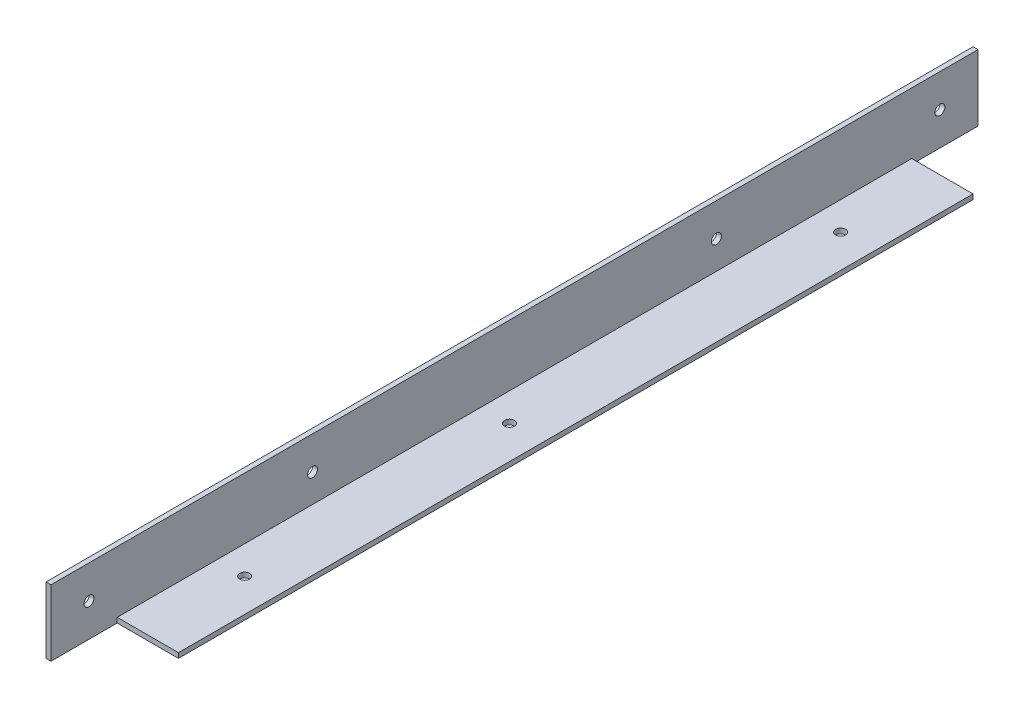
ISO-10303-21;
HEADER;
FILE_DESCRIPTION(('STEP AP214'),'2;1');
FILE_NAME('part.step','',(''),(''),'','','');
FILE_SCHEMA(('AUTOMOTIVE_DESIGN { 1 0 10303 214 1 1 1 1 }'));
ENDSEC;
DATA;
#1=APPLICATION_CONTEXT('core data for automotive mechanical design processes');
#2=APPLICATION_PROTOCOL_DEFINITION('international standard','automotive_design',2000,#1);
#3=PRODUCT_CONTEXT('',#1,'mechanical');
#4=PRODUCT('Part','Part','',(#3));
#5=PRODUCT_RELATED_PRODUCT_CATEGORY('part','',(#4));
#6=PRODUCT_DEFINITION_FORMATION('','',#4);
#7=PRODUCT_DEFINITION_CONTEXT('part definition',#1,'design');
#8=PRODUCT_DEFINITION('design','',#6,#7);
#9=PRODUCT_DEFINITION_SHAPE('','',#8);
#10=(LENGTH_UNIT() NAMED_UNIT(*) SI_UNIT(.MILLI.,.METRE.));
#11=(NAMED_UNIT(*) PLANE_ANGLE_UNIT() SI_UNIT($,.RADIAN.));
#12=(NAMED_UNIT(*) SI_UNIT($,.STERADIAN.) SOLID_ANGLE_UNIT());
#13=UNCERTAINTY_MEASURE_WITH_UNIT(LENGTH_MEASURE(1.E-05),#10,'distance_accuracy_value','');
#14=(GEOMETRIC_REPRESENTATION_CONTEXT(3) GLOBAL_UNCERTAINTY_ASSIGNED_CONTEXT((#13)) GLOBAL_UNIT_ASSIGNED_CONTEXT((#10,
#11,#12)) REPRESENTATION_CONTEXT('',''));
#15=CARTESIAN_POINT('',(0.,0.,0.));
#16=DIRECTION('',(0.,0.,1.));
#17=DIRECTION('',(1.,0.,0.));
#18=AXIS2_PLACEMENT_3D('',#15,#16,#17);
#19=CARTESIAN_POINT('',(0.,0.,0.));
#20=DIRECTION('',(0.,0.,1.));
#21=DIRECTION('',(1.,0.,0.));
#22=AXIS2_PLACEMENT_3D('',#19,#20,#21);
#23=PLANE('',#22);
#24=DIRECTION('',(0.,-1.,0.));
#25=VECTOR('',#24,1.);
#26=CARTESIAN_POINT('',(1.5,0.,0.));
#27=LINE('',#26,#25);
#28=CARTESIAN_POINT('',(1.5,1.5,0.));
#29=VERTEX_POINT('',#28);
#30=CARTESIAN_POINT('',(1.5,0.,0.));
#31=VERTEX_POINT('',#30);
#32=EDGE_CURVE('E11',#29,#31,#27,.T.);
#33=ORIENTED_EDGE('',*,*,#32,.F.);
#34=DIRECTION('',(-1.,0.,0.));
#35=VECTOR('',#34,1.);
#36=CARTESIAN_POINT('',(20.,1.5,0.));
#37=LINE('',#36,#35);
#38=CARTESIAN_POINT('',(20.,1.5,0.));
#39=VERTEX_POINT('',#38);
#40=EDGE_CURVE('E132',#39,#29,#37,.T.);
#41=ORIENTED_EDGE('',*,*,#40,.F.);
#42=DIRECTION('',(0.,1.,0.));
#43=VECTOR('',#42,1.);
#44=CARTESIAN_POINT('',(20.,0.,0.));
#45=LINE('',#44,#43);
#46=CARTESIAN_POINT('',(20.,0.,0.));
#47=VERTEX_POINT('',#46);
#48=EDGE_CURVE('E133',#47,#39,#45,.T.);
#49=ORIENTED_EDGE('',*,*,#48,.F.);
#50=DIRECTION('',(1.,0.,0.));
#51=VECTOR('',#50,1.);
#52=CARTESIAN_POINT('',(0.,0.,0.));
#53=LINE('',#52,#51);
#54=EDGE_CURVE('E138',#31,#47,#53,.T.);
#55=ORIENTED_EDGE('',*,*,#54,.F.);
#56=EDGE_LOOP('',(#33,#41,#49,#55));
#57=FACE_BOUND('',#56,.T.);
#58=ADVANCED_FACE('F31',(#57),#23,.F.);
#59=CARTESIAN_POINT('',(0.,20.,240.));
#60=DIRECTION('',(1.,0.,0.));
#61=DIRECTION('',(0.,1.,0.));
#62=AXIS2_PLACEMENT_3D('',#59,#60,#61);
#63=PLANE('',#62);
#64=CARTESIAN_POINT('',(0.,10.,59.));
#65=DIRECTION('',(1.,0.,0.));
#66=DIRECTION('',(0.,1.,0.));
#67=AXIS2_PLACEMENT_3D('',#64,#65,#66);
#68=CIRCLE('',#67,1.5);
#69=CARTESIAN_POINT('',(0.,11.5,59.));
#70=VERTEX_POINT('',#69);
#71=EDGE_CURVE('E261',#70,#70,#68,.T.);
#72=ORIENTED_EDGE('',*,*,#71,.T.);
#73=EDGE_LOOP('',(#72));
#74=FACE_BOUND('',#73,.T.);
#75=CARTESIAN_POINT('',(0.,10.,181.));
#76=DIRECTION('',(1.,0.,0.));
#77=DIRECTION('',(0.,1.,0.));
#78=AXIS2_PLACEMENT_3D('',#75,#76,#77);
#79=CIRCLE('',#78,1.5);
#80=CARTESIAN_POINT('',(0.,11.5,181.));
#81=VERTEX_POINT('',#80);
#82=EDGE_CURVE('E255',#81,#81,#79,.T.);
#83=ORIENTED_EDGE('',*,*,#82,.T.);
#84=EDGE_LOOP('',(#83));
#85=FACE_BOUND('',#84,.T.);
#86=CARTESIAN_POINT('',(0.,10.,-8.5));
#87=DIRECTION('',(1.,0.,0.));
#88=DIRECTION('',(0.,1.,0.));
#89=AXIS2_PLACEMENT_3D('',#86,#87,#88);
#90=CIRCLE('',#89,1.5);
#91=CARTESIAN_POINT('',(0.,11.5,-8.5));
#92=VERTEX_POINT('',#91);
#93=EDGE_CURVE('E249',#92,#92,#90,.T.);
#94=ORIENTED_EDGE('',*,*,#93,.T.);
#95=EDGE_LOOP('',(#94));
#96=FACE_BOUND('',#95,.T.);
#97=CARTESIAN_POINT('',(0.,10.,248.5));
#98=DIRECTION('',(1.,0.,0.));
#99=DIRECTION('',(0.,1.,0.));
#100=AXIS2_PLACEMENT_3D('',#97,#98,#99);
#101=CIRCLE('',#100,1.50000000000003);
#102=CARTESIAN_POINT('',(0.,11.5,248.5));
#103=VERTEX_POINT('',#102);
#104=EDGE_CURVE('E120',#103,#103,#101,.T.);
#105=ORIENTED_EDGE('',*,*,#104,.T.);
#106=EDGE_LOOP('',(#105));
#107=FACE_BOUND('',#106,.T.);
#108=DIRECTION('',(0.,0.,-1.));
#109=VECTOR('',#108,1.);
#110=CARTESIAN_POINT('',(0.,20.,240.));
#111=LINE('',#110,#109);
#112=CARTESIAN_POINT('',(0.,20.,260.));
#113=VERTEX_POINT('',#112);
#114=CARTESIAN_POINT('',(0.,20.,-20.));
#115=VERTEX_POINT('',#114);
#116=EDGE_CURVE('E149',#113,#115,#111,.T.);
#117=ORIENTED_EDGE('',*,*,#116,.T.);
#118=DIRECTION('',(0.,1.,0.));
#119=VECTOR('',#118,1.);
#120=CARTESIAN_POINT('',(0.,20.,-20.));
#121=LINE('',#120,#119);
#122=CARTESIAN_POINT('',(0.,0.,-20.));
#123=VERTEX_POINT('',#122);
#124=EDGE_CURVE('E111',#123,#115,#121,.T.);
#125=ORIENTED_EDGE('',*,*,#124,.F.);
#126=DIRECTION('',(0.,0.,-1.));
#127=VECTOR('',#126,1.);
#128=CARTESIAN_POINT('',(0.,0.,240.));
#129=LINE('',#128,#127);
#130=CARTESIAN_POINT('',(0.,0.,260.));
#131=VERTEX_POINT('',#130);
#132=EDGE_CURVE('E40',#131,#123,#129,.T.);
#133=ORIENTED_EDGE('',*,*,#132,.F.);
#134=DIRECTION('',(0.,-1.,0.));
#135=VECTOR('',#134,1.);
#136=CARTESIAN_POINT('',(0.,0.,260.));
#137=LINE('',#136,#135);
#138=EDGE_CURVE('E125',#113,#131,#137,.T.);
#139=ORIENTED_EDGE('',*,*,#138,.F.);
#140=EDGE_LOOP('',(#117,#125,#133,#139));
#141=FACE_BOUND('',#140,.T.);
#142=ADVANCED_FACE('F33',(#74,#85,#96,#107,#141),#63,.F.);
#143=CARTESIAN_POINT('',(0.,0.,240.));
#144=DIRECTION('',(0.,1.,0.));
#145=DIRECTION('',(0.,0.,1.));
#146=AXIS2_PLACEMENT_3D('',#143,#144,#145);
#147=PLANE('',#146);
#148=CARTESIAN_POINT('',(10.,0.,130.));
#149=DIRECTION('',(0.,1.,0.));
#150=DIRECTION('',(-1.,0.,0.));
#151=AXIS2_PLACEMENT_3D('',#148,#149,#150);
#152=CIRCLE('',#151,1.5);
#153=CARTESIAN_POINT('',(8.5,0.,130.));
#154=VERTEX_POINT('',#153);
#155=EDGE_CURVE('E180',#154,#154,#152,.T.);
#156=ORIENTED_EDGE('',*,*,#155,.T.);
#157=EDGE_LOOP('',(#156));
#158=FACE_BOUND('',#157,.T.);
#159=CARTESIAN_POINT('',(10.,0.,210.));
#160=DIRECTION('',(0.,1.,0.));
#161=DIRECTION('',(-1.,0.,0.));
#162=AXIS2_PLACEMENT_3D('',#159,#160,#161);
#163=CIRCLE('',#162,1.5);
#164=CARTESIAN_POINT('',(8.5,0.,210.));
#165=VERTEX_POINT('',#164);
#166=EDGE_CURVE('E202',#165,#165,#163,.T.);
#167=ORIENTED_EDGE('',*,*,#166,.T.);
#168=EDGE_LOOP('',(#167));
#169=FACE_BOUND('',#168,.T.);
#170=CARTESIAN_POINT('',(10.,0.,30.));
#171=DIRECTION('',(0.,1.,0.));
#172=DIRECTION('',(-1.,0.,0.));
#173=AXIS2_PLACEMENT_3D('',#170,#171,#172);
#174=CIRCLE('',#173,1.5);
#175=CARTESIAN_POINT('',(8.5,0.,30.));
#176=VERTEX_POINT('',#175);
#177=EDGE_CURVE('E144',#176,#176,#174,.T.);
#178=ORIENTED_EDGE('',*,*,#177,.T.);
#179=EDGE_LOOP('',(#178));
#180=FACE_BOUND('',#179,.T.);
#181=ORIENTED_EDGE('',*,*,#132,.T.);
#182=DIRECTION('',(-1.,0.,0.));
#183=VECTOR('',#182,1.);
#184=CARTESIAN_POINT('',(0.,0.,-20.));
#185=LINE('',#184,#183);
#186=CARTESIAN_POINT('',(1.5,0.,-20.));
#187=VERTEX_POINT('',#186);
#188=EDGE_CURVE('E102',#187,#123,#185,.T.);
#189=ORIENTED_EDGE('',*,*,#188,.F.);
#190=DIRECTION('',(0.,0.,1.));
#191=VECTOR('',#190,1.);
#192=CARTESIAN_POINT('',(1.5,0.,-20.));
#193=LINE('',#192,#191);
#194=EDGE_CURVE('E106',#187,#31,#193,.T.);
#195=ORIENTED_EDGE('',*,*,#194,.T.);
#196=ORIENTED_EDGE('',*,*,#54,.T.);
#197=DIRECTION('',(0.,0.,-1.));
#198=VECTOR('',#197,1.);
#199=CARTESIAN_POINT('',(20.,0.,240.));
#200=LINE('',#199,#198);
#201=CARTESIAN_POINT('',(20.,0.,240.));
#202=VERTEX_POINT('',#201);
#203=EDGE_CURVE('E156',#202,#47,#200,.T.);
#204=ORIENTED_EDGE('',*,*,#203,.F.);
#205=DIRECTION('',(1.,0.,0.));
#206=VECTOR('',#205,1.);
#207=CARTESIAN_POINT('',(0.,0.,240.));
#208=LINE('',#207,#206);
#209=CARTESIAN_POINT('',(1.5,0.,240.));
#210=VERTEX_POINT('',#209);
#211=EDGE_CURVE('E72',#210,#202,#208,.T.);
#212=ORIENTED_EDGE('',*,*,#211,.F.);
#213=DIRECTION('',(0.,0.,-1.));
#214=VECTOR('',#213,1.);
#215=CARTESIAN_POINT('',(1.5,0.,260.));
#216=LINE('',#215,#214);
#217=CARTESIAN_POINT('',(1.5,0.,260.));
#218=VERTEX_POINT('',#217);
#219=EDGE_CURVE('E173',#218,#210,#216,.T.);
#220=ORIENTED_EDGE('',*,*,#219,.F.);
#221=DIRECTION('',(1.,0.,0.));
#222=VECTOR('',#221,1.);
#223=CARTESIAN_POINT('',(1.5,0.,260.));
#224=LINE('',#223,#222);
#225=EDGE_CURVE('E193',#131,#218,#224,.T.);
#226=ORIENTED_EDGE('',*,*,#225,.F.);
#227=EDGE_LOOP('',(#181,#189,#195,#196,#204,#212,#220,#226));
#228=FACE_BOUND('',#227,.T.);
#229=ADVANCED_FACE('F104',(#158,#169,#180,#228),#147,.F.);
#230=CARTESIAN_POINT('',(20.,0.,240.));
#231=DIRECTION('',(-1.,0.,0.));
#232=DIRECTION('',(0.,0.,1.));
#233=AXIS2_PLACEMENT_3D('',#230,#231,#232);
#234=PLANE('',#233);
#235=ORIENTED_EDGE('',*,*,#48,.T.);
#236=DIRECTION('',(0.,0.,-1.));
#237=VECTOR('',#236,1.);
#238=CARTESIAN_POINT('',(20.,1.5,240.));
#239=LINE('',#238,#237);
#240=CARTESIAN_POINT('',(20.,1.5,240.));
#241=VERTEX_POINT('',#240);
#242=EDGE_CURVE('E154',#241,#39,#239,.T.);
#243=ORIENTED_EDGE('',*,*,#242,.F.);
#244=DIRECTION('',(0.,1.,0.));
#245=VECTOR('',#244,1.);
#246=CARTESIAN_POINT('',(20.,0.,240.));
#247=LINE('',#246,#245);
#248=EDGE_CURVE('E136',#202,#241,#247,.T.);
#249=ORIENTED_EDGE('',*,*,#248,.F.);
#250=ORIENTED_EDGE('',*,*,#203,.T.);
#251=EDGE_LOOP('',(#235,#243,#249,#250));
#252=FACE_BOUND('',#251,.T.);
#253=ADVANCED_FACE('F167',(#252),#234,.F.);
#254=CARTESIAN_POINT('',(20.,1.5,240.));
#255=DIRECTION('',(0.,-1.,0.));
#256=DIRECTION('',(1.,0.,0.));
#257=AXIS2_PLACEMENT_3D('',#254,#255,#256);
#258=PLANE('',#257);
#259=CARTESIAN_POINT('',(10.,1.5,130.));
#260=DIRECTION('',(0.,1.,0.));
#261=DIRECTION('',(-1.,0.,0.));
#262=AXIS2_PLACEMENT_3D('',#259,#260,#261);
#263=CIRCLE('',#262,1.5);
#264=CARTESIAN_POINT('',(8.5,1.5,130.));
#265=VERTEX_POINT('',#264);
#266=EDGE_CURVE('E176',#265,#265,#263,.T.);
#267=ORIENTED_EDGE('',*,*,#266,.F.);
#268=EDGE_LOOP('',(#267));
#269=FACE_BOUND('',#268,.T.);
#270=CARTESIAN_POINT('',(10.,1.5,210.));
#271=DIRECTION('',(0.,1.,0.));
#272=DIRECTION('',(-1.,0.,0.));
#273=AXIS2_PLACEMENT_3D('',#270,#271,#272);
#274=CIRCLE('',#273,1.5);
#275=CARTESIAN_POINT('',(8.5,1.5,210.));
#276=VERTEX_POINT('',#275);
#277=EDGE_CURVE('E200',#276,#276,#274,.T.);
#278=ORIENTED_EDGE('',*,*,#277,.F.);
#279=EDGE_LOOP('',(#278));
#280=FACE_BOUND('',#279,.T.);
#281=CARTESIAN_POINT('',(10.,1.5,30.));
#282=DIRECTION('',(0.,1.,0.));
#283=DIRECTION('',(-1.,0.,0.));
#284=AXIS2_PLACEMENT_3D('',#281,#282,#283);
#285=CIRCLE('',#284,1.5);
#286=CARTESIAN_POINT('',(8.5,1.5,30.));
#287=VERTEX_POINT('',#286);
#288=EDGE_CURVE('E163',#287,#287,#285,.T.);
#289=ORIENTED_EDGE('',*,*,#288,.F.);
#290=EDGE_LOOP('',(#289));
#291=FACE_BOUND('',#290,.T.);
#292=ORIENTED_EDGE('',*,*,#40,.T.);
#293=DIRECTION('',(0.,0.,-1.));
#294=VECTOR('',#293,1.);
#295=CARTESIAN_POINT('',(1.5,1.5,240.));
#296=LINE('',#295,#294);
#297=CARTESIAN_POINT('',(1.5,1.5,240.));
#298=VERTEX_POINT('',#297);
#299=EDGE_CURVE('E153',#298,#29,#296,.T.);
#300=ORIENTED_EDGE('',*,*,#299,.F.);
#301=DIRECTION('',(-1.,0.,0.));
#302=VECTOR('',#301,1.);
#303=CARTESIAN_POINT('',(20.,1.5,240.));
#304=LINE('',#303,#302);
#305=EDGE_CURVE('E54',#241,#298,#304,.T.);
#306=ORIENTED_EDGE('',*,*,#305,.F.);
#307=ORIENTED_EDGE('',*,*,#242,.T.);
#308=EDGE_LOOP('',(#292,#300,#306,#307));
#309=FACE_BOUND('',#308,.T.);
#310=ADVANCED_FACE('F168',(#269,#280,#291,#309),#258,.F.);
#311=CARTESIAN_POINT('',(1.5,1.5,240.));
#312=DIRECTION('',(-1.,0.,0.));
#313=DIRECTION('',(0.,-1.,0.));
#314=AXIS2_PLACEMENT_3D('',#311,#312,#313);
#315=PLANE('',#314);
#316=CARTESIAN_POINT('',(1.5,10.,59.));
#317=DIRECTION('',(1.,0.,0.));
#318=DIRECTION('',(0.,1.,0.));
#319=AXIS2_PLACEMENT_3D('',#316,#317,#318);
#320=CIRCLE('',#319,1.5);
#321=CARTESIAN_POINT('',(1.5,11.5,59.));
#322=VERTEX_POINT('',#321);
#323=EDGE_CURVE('E264',#322,#322,#320,.T.);
#324=ORIENTED_EDGE('',*,*,#323,.F.);
#325=EDGE_LOOP('',(#324));
#326=FACE_BOUND('',#325,.T.);
#327=CARTESIAN_POINT('',(1.5,10.,181.));
#328=DIRECTION('',(1.,0.,0.));
#329=DIRECTION('',(0.,1.,0.));
#330=AXIS2_PLACEMENT_3D('',#327,#328,#329);
#331=CIRCLE('',#330,1.5);
#332=CARTESIAN_POINT('',(1.5,11.5,181.));
#333=VERTEX_POINT('',#332);
#334=EDGE_CURVE('E258',#333,#333,#331,.T.);
#335=ORIENTED_EDGE('',*,*,#334,.F.);
#336=EDGE_LOOP('',(#335));
#337=FACE_BOUND('',#336,.T.);
#338=CARTESIAN_POINT('',(1.5,10.,-8.5));
#339=DIRECTION('',(1.,0.,0.));
#340=DIRECTION('',(0.,1.,0.));
#341=AXIS2_PLACEMENT_3D('',#338,#339,#340);
#342=CIRCLE('',#341,1.5);
#343=CARTESIAN_POINT('',(1.5,11.5,-8.5));
#344=VERTEX_POINT('',#343);
#345=EDGE_CURVE('E252',#344,#344,#342,.T.);
#346=ORIENTED_EDGE('',*,*,#345,.F.);
#347=EDGE_LOOP('',(#346));
#348=FACE_BOUND('',#347,.T.);
#349=CARTESIAN_POINT('',(1.5,10.,248.5));
#350=DIRECTION('',(1.,0.,0.));
#351=DIRECTION('',(0.,1.,0.));
#352=AXIS2_PLACEMENT_3D('',#349,#350,#351);
#353=CIRCLE('',#352,1.50000000000003);
#354=CARTESIAN_POINT('',(1.5,11.5,248.5));
#355=VERTEX_POINT('',#354);
#356=EDGE_CURVE('E246',#355,#355,#353,.T.);
#357=ORIENTED_EDGE('',*,*,#356,.F.);
#358=EDGE_LOOP('',(#357));
#359=FACE_BOUND('',#358,.T.);
#360=ORIENTED_EDGE('',*,*,#299,.T.);
#361=ORIENTED_EDGE('',*,*,#32,.T.);
#362=ORIENTED_EDGE('',*,*,#194,.F.);
#363=DIRECTION('',(0.,-1.,0.));
#364=VECTOR('',#363,1.);
#365=CARTESIAN_POINT('',(1.5,0.,-20.));
#366=LINE('',#365,#364);
#367=CARTESIAN_POINT('',(1.5,20.,-20.));
#368=VERTEX_POINT('',#367);
#369=EDGE_CURVE('E112',#368,#187,#366,.T.);
#370=ORIENTED_EDGE('',*,*,#369,.F.);
#371=DIRECTION('',(0.,0.,-1.));
#372=VECTOR('',#371,1.);
#373=CARTESIAN_POINT('',(1.5,20.,240.));
#374=LINE('',#373,#372);
#375=CARTESIAN_POINT('',(1.5,20.,260.));
#376=VERTEX_POINT('',#375);
#377=EDGE_CURVE('E151',#376,#368,#374,.T.);
#378=ORIENTED_EDGE('',*,*,#377,.F.);
#379=DIRECTION('',(0.,1.,0.));
#380=VECTOR('',#379,1.);
#381=CARTESIAN_POINT('',(1.5,20.,260.));
#382=LINE('',#381,#380);
#383=EDGE_CURVE('E175',#218,#376,#382,.T.);
#384=ORIENTED_EDGE('',*,*,#383,.F.);
#385=ORIENTED_EDGE('',*,*,#219,.T.);
#386=DIRECTION('',(0.,1.,0.));
#387=VECTOR('',#386,1.);
#388=CARTESIAN_POINT('',(1.5,20.,240.));
#389=LINE('',#388,#387);
#390=EDGE_CURVE('E48',#210,#298,#389,.T.);
#391=ORIENTED_EDGE('',*,*,#390,.T.);
#392=EDGE_LOOP('',(#360,#361,#362,#370,#378,#384,#385,#391));
#393=FACE_BOUND('',#392,.T.);
#394=ADVANCED_FACE('F123',(#326,#337,#348,#359,#393),#315,.F.);
#395=CARTESIAN_POINT('',(1.5,20.,240.));
#396=DIRECTION('',(0.,-1.,0.));
#397=DIRECTION('',(0.,0.,-1.));
#398=AXIS2_PLACEMENT_3D('',#395,#396,#397);
#399=PLANE('',#398);
#400=ORIENTED_EDGE('',*,*,#377,.T.);
#401=DIRECTION('',(1.,0.,0.));
#402=VECTOR('',#401,1.);
#403=CARTESIAN_POINT('',(1.5,20.,-20.));
#404=LINE('',#403,#402);
#405=EDGE_CURVE('E118',#115,#368,#404,.T.);
#406=ORIENTED_EDGE('',*,*,#405,.F.);
#407=ORIENTED_EDGE('',*,*,#116,.F.);
#408=DIRECTION('',(-1.,0.,0.));
#409=VECTOR('',#408,1.);
#410=CARTESIAN_POINT('',(0.,20.,260.));
#411=LINE('',#410,#409);
#412=EDGE_CURVE('E177',#376,#113,#411,.T.);
#413=ORIENTED_EDGE('',*,*,#412,.F.);
#414=EDGE_LOOP('',(#400,#406,#407,#413));
#415=FACE_BOUND('',#414,.T.);
#416=ADVANCED_FACE('F221',(#415),#399,.F.);
#417=CARTESIAN_POINT('',(0.,0.,240.));
#418=DIRECTION('',(0.,0.,1.));
#419=DIRECTION('',(1.,0.,0.));
#420=AXIS2_PLACEMENT_3D('',#417,#418,#419);
#421=PLANE('',#420);
#422=ORIENTED_EDGE('',*,*,#390,.F.);
#423=ORIENTED_EDGE('',*,*,#211,.T.);
#424=ORIENTED_EDGE('',*,*,#248,.T.);
#425=ORIENTED_EDGE('',*,*,#305,.T.);
#426=EDGE_LOOP('',(#422,#423,#424,#425));
#427=FACE_BOUND('',#426,.T.);
#428=ADVANCED_FACE('F166',(#427),#421,.T.);
#429=CARTESIAN_POINT('',(10.,0.,30.));
#430=DIRECTION('',(0.,1.,0.));
#431=DIRECTION('',(-1.,0.,0.));
#432=AXIS2_PLACEMENT_3D('',#429,#430,#431);
#433=CYLINDRICAL_SURFACE('',#432,1.5);
#434=ORIENTED_EDGE('',*,*,#177,.F.);
#435=EDGE_LOOP('',(#434));
#436=FACE_BOUND('',#435,.T.);
#437=ORIENTED_EDGE('',*,*,#288,.T.);
#438=EDGE_LOOP('',(#437));
#439=FACE_BOUND('',#438,.T.);
#440=ADVANCED_FACE('F212',(#436,#439),#433,.F.);
#441=CARTESIAN_POINT('',(10.,0.,210.));
#442=DIRECTION('',(0.,1.,0.));
#443=DIRECTION('',(-1.,0.,0.));
#444=AXIS2_PLACEMENT_3D('',#441,#442,#443);
#445=CYLINDRICAL_SURFACE('',#444,1.5);
#446=ORIENTED_EDGE('',*,*,#166,.F.);
#447=EDGE_LOOP('',(#446));
#448=FACE_BOUND('',#447,.T.);
#449=ORIENTED_EDGE('',*,*,#277,.T.);
#450=EDGE_LOOP('',(#449));
#451=FACE_BOUND('',#450,.T.);
#452=ADVANCED_FACE('F304',(#448,#451),#445,.F.);
#453=CARTESIAN_POINT('',(10.,0.,130.));
#454=DIRECTION('',(0.,1.,0.));
#455=DIRECTION('',(-1.,0.,0.));
#456=AXIS2_PLACEMENT_3D('',#453,#454,#455);
#457=CYLINDRICAL_SURFACE('',#456,1.5);
#458=ORIENTED_EDGE('',*,*,#155,.F.);
#459=EDGE_LOOP('',(#458));
#460=FACE_BOUND('',#459,.T.);
#461=ORIENTED_EDGE('',*,*,#266,.T.);
#462=EDGE_LOOP('',(#461));
#463=FACE_BOUND('',#462,.T.);
#464=ADVANCED_FACE('F301',(#460,#463),#457,.F.);
#465=CARTESIAN_POINT('',(0.,20.,260.));
#466=DIRECTION('',(0.,0.,-1.));
#467=DIRECTION('',(-1.,0.,0.));
#468=AXIS2_PLACEMENT_3D('',#465,#466,#467);
#469=PLANE('',#468);
#470=ORIENTED_EDGE('',*,*,#138,.T.);
#471=ORIENTED_EDGE('',*,*,#225,.T.);
#472=ORIENTED_EDGE('',*,*,#383,.T.);
#473=ORIENTED_EDGE('',*,*,#412,.T.);
#474=EDGE_LOOP('',(#470,#471,#472,#473));
#475=FACE_BOUND('',#474,.T.);
#476=ADVANCED_FACE('F241',(#475),#469,.F.);
#477=CARTESIAN_POINT('',(1.5,20.,-20.));
#478=DIRECTION('',(0.,0.,1.));
#479=DIRECTION('',(1.,0.,0.));
#480=AXIS2_PLACEMENT_3D('',#477,#478,#479);
#481=PLANE('',#480);
#482=ORIENTED_EDGE('',*,*,#369,.T.);
#483=ORIENTED_EDGE('',*,*,#188,.T.);
#484=ORIENTED_EDGE('',*,*,#124,.T.);
#485=ORIENTED_EDGE('',*,*,#405,.T.);
#486=EDGE_LOOP('',(#482,#483,#484,#485));
#487=FACE_BOUND('',#486,.T.);
#488=ADVANCED_FACE('F116',(#487),#481,.F.);
#489=CARTESIAN_POINT('',(0.,10.,248.5));
#490=DIRECTION('',(1.,0.,0.));
#491=DIRECTION('',(0.,1.,0.));
#492=AXIS2_PLACEMENT_3D('',#489,#490,#491);
#493=CYLINDRICAL_SURFACE('',#492,1.50000000000003);
#494=ORIENTED_EDGE('',*,*,#104,.F.);
#495=EDGE_LOOP('',(#494));
#496=FACE_BOUND('',#495,.T.);
#497=ORIENTED_EDGE('',*,*,#356,.T.);
#498=EDGE_LOOP('',(#497));
#499=FACE_BOUND('',#498,.T.);
#500=ADVANCED_FACE('F284',(#496,#499),#493,.F.);
#501=CARTESIAN_POINT('',(0.,10.,-8.5));
#502=DIRECTION('',(1.,0.,0.));
#503=DIRECTION('',(0.,1.,0.));
#504=AXIS2_PLACEMENT_3D('',#501,#502,#503);
#505=CYLINDRICAL_SURFACE('',#504,1.5);
#506=ORIENTED_EDGE('',*,*,#93,.F.);
#507=EDGE_LOOP('',(#506));
#508=FACE_BOUND('',#507,.T.);
#509=ORIENTED_EDGE('',*,*,#345,.T.);
#510=EDGE_LOOP('',(#509));
#511=FACE_BOUND('',#510,.T.);
#512=ADVANCED_FACE('F286',(#508,#511),#505,.F.);
#513=CARTESIAN_POINT('',(0.,10.,181.));
#514=DIRECTION('',(1.,0.,0.));
#515=DIRECTION('',(0.,1.,0.));
#516=AXIS2_PLACEMENT_3D('',#513,#514,#515);
#517=CYLINDRICAL_SURFACE('',#516,1.5);
#518=ORIENTED_EDGE('',*,*,#82,.F.);
#519=EDGE_LOOP('',(#518));
#520=FACE_BOUND('',#519,.T.);
#521=ORIENTED_EDGE('',*,*,#334,.T.);
#522=EDGE_LOOP('',(#521));
#523=FACE_BOUND('',#522,.T.);
#524=ADVANCED_FACE('F274',(#520,#523),#517,.F.);
#525=CARTESIAN_POINT('',(0.,10.,59.));
#526=DIRECTION('',(1.,0.,0.));
#527=DIRECTION('',(0.,1.,0.));
#528=AXIS2_PLACEMENT_3D('',#525,#526,#527);
#529=CYLINDRICAL_SURFACE('',#528,1.5);
#530=ORIENTED_EDGE('',*,*,#71,.F.);
#531=EDGE_LOOP('',(#530));
#532=FACE_BOUND('',#531,.T.);
#533=ORIENTED_EDGE('',*,*,#323,.T.);
#534=EDGE_LOOP('',(#533));
#535=FACE_BOUND('',#534,.T.);
#536=ADVANCED_FACE('F271',(#532,#535),#529,.F.);
#537=CLOSED_SHELL('',(#58,#142,#229,#253,#310,#394,#416,#428,#440,#452,#464,#476,#488,#500,#512,
#524,#536));
#538=MANIFOLD_SOLID_BREP('B2',#537);
#539=ADVANCED_BREP_SHAPE_REPRESENTATION('',(#18,#538),#14);
#540=SHAPE_DEFINITION_REPRESENTATION(#9,#539);
ENDSEC;
END-ISO-10303-21;
